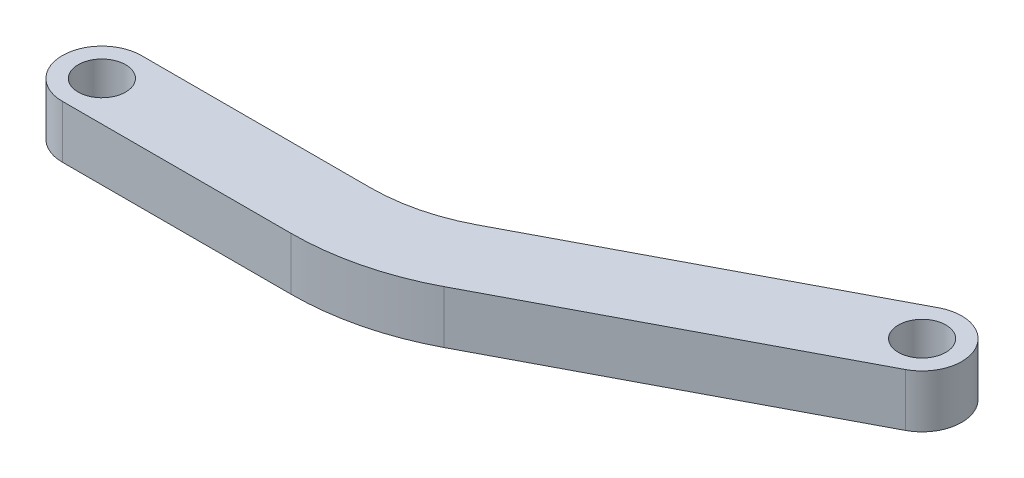
ISO-10303-21;
HEADER;
FILE_DESCRIPTION(('STEP AP214'),'2;1');
FILE_NAME('part.step','',(''),(''),'','','');
FILE_SCHEMA(('AUTOMOTIVE_DESIGN { 1 0 10303 214 1 1 1 1 }'));
ENDSEC;
DATA;
#1=APPLICATION_CONTEXT('core data for automotive mechanical design processes');
#2=APPLICATION_PROTOCOL_DEFINITION('international standard','automotive_design',2000,#1);
#3=PRODUCT_CONTEXT('',#1,'mechanical');
#4=PRODUCT('Part','Part','',(#3));
#5=PRODUCT_RELATED_PRODUCT_CATEGORY('part','',(#4));
#6=PRODUCT_DEFINITION_FORMATION('','',#4);
#7=PRODUCT_DEFINITION_CONTEXT('part definition',#1,'design');
#8=PRODUCT_DEFINITION('design','',#6,#7);
#9=PRODUCT_DEFINITION_SHAPE('','',#8);
#10=(LENGTH_UNIT() NAMED_UNIT(*) SI_UNIT(.MILLI.,.METRE.));
#11=(NAMED_UNIT(*) PLANE_ANGLE_UNIT() SI_UNIT($,.RADIAN.));
#12=(NAMED_UNIT(*) SI_UNIT($,.STERADIAN.) SOLID_ANGLE_UNIT());
#13=UNCERTAINTY_MEASURE_WITH_UNIT(LENGTH_MEASURE(1.E-05),#10,'distance_accuracy_value','');
#14=(GEOMETRIC_REPRESENTATION_CONTEXT(3) GLOBAL_UNCERTAINTY_ASSIGNED_CONTEXT((#13)) GLOBAL_UNIT_ASSIGNED_CONTEXT((#10,
#11,#12)) REPRESENTATION_CONTEXT('',''));
#15=CARTESIAN_POINT('',(0.,0.,0.));
#16=DIRECTION('',(0.,0.,1.));
#17=DIRECTION('',(1.,0.,0.));
#18=AXIS2_PLACEMENT_3D('',#15,#16,#17);
#19=CARTESIAN_POINT('',(0.,6.,0.));
#20=DIRECTION('',(0.,1.,0.));
#21=DIRECTION('',(0.,0.,1.));
#22=AXIS2_PLACEMENT_3D('',#19,#20,#21);
#23=PLANE('',#22);
#24=CARTESIAN_POINT('',(0.,6.,0.));
#25=DIRECTION('',(0.,1.,0.));
#26=DIRECTION('',(0.,0.,1.));
#27=AXIS2_PLACEMENT_3D('',#24,#25,#26);
#28=CIRCLE('',#27,2.7);
#29=CARTESIAN_POINT('',(0.,6.,2.7));
#30=VERTEX_POINT('',#29);
#31=EDGE_CURVE('E150',#30,#30,#28,.T.);
#32=ORIENTED_EDGE('',*,*,#31,.F.);
#33=EDGE_LOOP('',(#32));
#34=FACE_BOUND('',#33,.T.);
#35=CARTESIAN_POINT('',(0.,6.,0.));
#36=DIRECTION('',(0.,1.,0.));
#37=DIRECTION('',(0.,0.,1.));
#38=AXIS2_PLACEMENT_3D('',#35,#36,#37);
#39=CIRCLE('',#38,4.5);
#40=CARTESIAN_POINT('',(0.,6.,-4.5));
#41=VERTEX_POINT('',#40);
#42=CARTESIAN_POINT('',(0.,6.,4.5));
#43=VERTEX_POINT('',#42);
#44=EDGE_CURVE('E168',#41,#43,#39,.T.);
#45=ORIENTED_EDGE('',*,*,#44,.T.);
#46=DIRECTION('',(1.,0.,0.));
#47=VECTOR('',#46,1.);
#48=CARTESIAN_POINT('',(0.,6.,4.5));
#49=LINE('',#48,#47);
#50=CARTESIAN_POINT('',(25.98,6.,4.5));
#51=VERTEX_POINT('',#50);
#52=EDGE_CURVE('E104',#43,#51,#49,.T.);
#53=ORIENTED_EDGE('',*,*,#52,.T.);
#54=CARTESIAN_POINT('',(25.98,6.,-25.5));
#55=DIRECTION('',(0.,1.,0.));
#56=DIRECTION('',(0.,0.,1.));
#57=AXIS2_PLACEMENT_3D('',#54,#55,#56);
#58=CIRCLE('',#57,30.);
#59=CARTESIAN_POINT('',(39.9303771253398,6.,1.05912231344994));
#60=VERTEX_POINT('',#59);
#61=EDGE_CURVE('E189',#51,#60,#58,.T.);
#62=ORIENTED_EDGE('',*,*,#61,.T.);
#63=DIRECTION('',(0.885304077114998,0.,-0.465012570844662));
#64=VECTOR('',#63,1.);
#65=CARTESIAN_POINT('',(39.9303771253398,6.,1.05912231344994));
#66=LINE('',#65,#64);
#67=CARTESIAN_POINT('',(74.342556568801,6.,-17.0161316529825));
#68=VERTEX_POINT('',#67);
#69=EDGE_CURVE('E203',#60,#68,#66,.T.);
#70=ORIENTED_EDGE('',*,*,#69,.T.);
#71=CARTESIAN_POINT('',(72.25,6.,-21.));
#72=DIRECTION('',(0.,1.,0.));
#73=DIRECTION('',(0.,0.,1.));
#74=AXIS2_PLACEMENT_3D('',#71,#72,#73);
#75=CIRCLE('',#74,4.5);
#76=CARTESIAN_POINT('',(70.157443431199,6.,-24.9838683470175));
#77=VERTEX_POINT('',#76);
#78=EDGE_CURVE('E123',#68,#77,#75,.T.);
#79=ORIENTED_EDGE('',*,*,#78,.T.);
#80=DIRECTION('',(-0.885304077114998,0.,0.465012570844662));
#81=VECTOR('',#80,1.);
#82=CARTESIAN_POINT('',(70.157443431199,6.,-24.9838683470175));
#83=LINE('',#82,#81);
#84=CARTESIAN_POINT('',(35.7452639877379,6.,-6.90861438058505));
#85=VERTEX_POINT('',#84);
#86=EDGE_CURVE('E117',#77,#85,#83,.T.);
#87=ORIENTED_EDGE('',*,*,#86,.T.);
#88=CARTESIAN_POINT('',(25.98,6.,-25.5));
#89=DIRECTION('',(0.,-1.,0.));
#90=DIRECTION('',(0.,0.,-1.));
#91=AXIS2_PLACEMENT_3D('',#88,#89,#90);
#92=CIRCLE('',#91,21.);
#93=CARTESIAN_POINT('',(25.98,6.,-4.50000000000001));
#94=VERTEX_POINT('',#93);
#95=EDGE_CURVE('E121',#85,#94,#92,.T.);
#96=ORIENTED_EDGE('',*,*,#95,.T.);
#97=DIRECTION('',(-1.,0.,0.));
#98=VECTOR('',#97,1.);
#99=CARTESIAN_POINT('',(25.98,6.,-4.5));
#100=LINE('',#99,#98);
#101=EDGE_CURVE('E61',#94,#41,#100,.T.);
#102=ORIENTED_EDGE('',*,*,#101,.T.);
#103=EDGE_LOOP('',(#45,#53,#62,#70,#79,#87,#96,#102));
#104=FACE_BOUND('',#103,.T.);
#105=CARTESIAN_POINT('',(72.25,6.,-21.));
#106=DIRECTION('',(0.,1.,0.));
#107=DIRECTION('',(0.,0.,1.));
#108=AXIS2_PLACEMENT_3D('',#105,#106,#107);
#109=CIRCLE('',#108,2.7);
#110=CARTESIAN_POINT('',(72.25,6.,-18.3));
#111=VERTEX_POINT('',#110);
#112=EDGE_CURVE('E217',#111,#111,#109,.T.);
#113=ORIENTED_EDGE('',*,*,#112,.F.);
#114=EDGE_LOOP('',(#113));
#115=FACE_BOUND('',#114,.T.);
#116=ADVANCED_FACE('F43',(#34,#104,#115),#23,.T.);
#117=CARTESIAN_POINT('',(0.,0.,0.));
#118=DIRECTION('',(0.,1.,0.));
#119=DIRECTION('',(0.,0.,1.));
#120=AXIS2_PLACEMENT_3D('',#117,#118,#119);
#121=PLANE('',#120);
#122=CARTESIAN_POINT('',(0.,0.,0.));
#123=DIRECTION('',(0.,1.,0.));
#124=DIRECTION('',(0.,0.,1.));
#125=AXIS2_PLACEMENT_3D('',#122,#123,#124);
#126=CIRCLE('',#125,4.5);
#127=CARTESIAN_POINT('',(0.,0.,-4.5));
#128=VERTEX_POINT('',#127);
#129=CARTESIAN_POINT('',(0.,0.,4.5));
#130=VERTEX_POINT('',#129);
#131=EDGE_CURVE('E145',#128,#130,#126,.T.);
#132=ORIENTED_EDGE('',*,*,#131,.F.);
#133=DIRECTION('',(-1.,0.,0.));
#134=VECTOR('',#133,1.);
#135=CARTESIAN_POINT('',(25.98,0.,-4.5));
#136=LINE('',#135,#134);
#137=CARTESIAN_POINT('',(25.98,0.,-4.50000000000001));
#138=VERTEX_POINT('',#137);
#139=EDGE_CURVE('E96',#138,#128,#136,.T.);
#140=ORIENTED_EDGE('',*,*,#139,.F.);
#141=CARTESIAN_POINT('',(25.98,0.,-25.5));
#142=DIRECTION('',(0.,-1.,0.));
#143=DIRECTION('',(0.,0.,-1.));
#144=AXIS2_PLACEMENT_3D('',#141,#142,#143);
#145=CIRCLE('',#144,21.);
#146=CARTESIAN_POINT('',(35.7452639877379,0.,-6.90861438058505));
#147=VERTEX_POINT('',#146);
#148=EDGE_CURVE('E90',#147,#138,#145,.T.);
#149=ORIENTED_EDGE('',*,*,#148,.F.);
#150=DIRECTION('',(-0.885304077114998,0.,0.465012570844662));
#151=VECTOR('',#150,1.);
#152=CARTESIAN_POINT('',(70.157443431199,0.,-24.9838683470175));
#153=LINE('',#152,#151);
#154=CARTESIAN_POINT('',(70.157443431199,0.,-24.9838683470175));
#155=VERTEX_POINT('',#154);
#156=EDGE_CURVE('E132',#155,#147,#153,.T.);
#157=ORIENTED_EDGE('',*,*,#156,.F.);
#158=CARTESIAN_POINT('',(72.25,0.,-21.));
#159=DIRECTION('',(0.,1.,0.));
#160=DIRECTION('',(0.,0.,1.));
#161=AXIS2_PLACEMENT_3D('',#158,#159,#160);
#162=CIRCLE('',#161,4.5);
#163=CARTESIAN_POINT('',(74.342556568801,0.,-17.0161316529825));
#164=VERTEX_POINT('',#163);
#165=EDGE_CURVE('E159',#164,#155,#162,.T.);
#166=ORIENTED_EDGE('',*,*,#165,.F.);
#167=DIRECTION('',(0.885304077114998,0.,-0.465012570844662));
#168=VECTOR('',#167,1.);
#169=CARTESIAN_POINT('',(39.9303771253398,0.,1.05912231344994));
#170=LINE('',#169,#168);
#171=CARTESIAN_POINT('',(39.9303771253398,0.,1.05912231344994));
#172=VERTEX_POINT('',#171);
#173=EDGE_CURVE('E156',#172,#164,#170,.T.);
#174=ORIENTED_EDGE('',*,*,#173,.F.);
#175=CARTESIAN_POINT('',(25.98,0.,-25.5));
#176=DIRECTION('',(0.,1.,0.));
#177=DIRECTION('',(0.,0.,1.));
#178=AXIS2_PLACEMENT_3D('',#175,#176,#177);
#179=CIRCLE('',#178,30.);
#180=CARTESIAN_POINT('',(25.98,0.,4.5));
#181=VERTEX_POINT('',#180);
#182=EDGE_CURVE('E153',#181,#172,#179,.T.);
#183=ORIENTED_EDGE('',*,*,#182,.F.);
#184=DIRECTION('',(1.,0.,0.));
#185=VECTOR('',#184,1.);
#186=CARTESIAN_POINT('',(0.,0.,4.5));
#187=LINE('',#186,#185);
#188=EDGE_CURVE('E149',#130,#181,#187,.T.);
#189=ORIENTED_EDGE('',*,*,#188,.F.);
#190=EDGE_LOOP('',(#132,#140,#149,#157,#166,#174,#183,#189));
#191=FACE_BOUND('',#190,.T.);
#192=CARTESIAN_POINT('',(0.,0.,0.));
#193=DIRECTION('',(0.,1.,0.));
#194=DIRECTION('',(0.,0.,1.));
#195=AXIS2_PLACEMENT_3D('',#192,#193,#194);
#196=CIRCLE('',#195,2.7);
#197=CARTESIAN_POINT('',(0.,0.,2.7));
#198=VERTEX_POINT('',#197);
#199=EDGE_CURVE('E213',#198,#198,#196,.T.);
#200=ORIENTED_EDGE('',*,*,#199,.T.);
#201=EDGE_LOOP('',(#200));
#202=FACE_BOUND('',#201,.T.);
#203=CARTESIAN_POINT('',(72.25,0.,-21.));
#204=DIRECTION('',(0.,1.,0.));
#205=DIRECTION('',(0.,0.,1.));
#206=AXIS2_PLACEMENT_3D('',#203,#204,#205);
#207=CIRCLE('',#206,2.7);
#208=CARTESIAN_POINT('',(72.25,0.,-18.3));
#209=VERTEX_POINT('',#208);
#210=EDGE_CURVE('E221',#209,#209,#207,.T.);
#211=ORIENTED_EDGE('',*,*,#210,.T.);
#212=EDGE_LOOP('',(#211));
#213=FACE_BOUND('',#212,.T.);
#214=ADVANCED_FACE('F193',(#191,#202,#213),#121,.F.);
#215=CARTESIAN_POINT('',(0.,6.,0.));
#216=DIRECTION('',(0.,-1.,0.));
#217=DIRECTION('',(0.,0.,-1.));
#218=AXIS2_PLACEMENT_3D('',#215,#216,#217);
#219=CYLINDRICAL_SURFACE('',#218,4.5);
#220=ORIENTED_EDGE('',*,*,#131,.T.);
#221=DIRECTION('',(0.,-1.,0.));
#222=VECTOR('',#221,1.);
#223=CARTESIAN_POINT('',(0.,6.,4.5));
#224=LINE('',#223,#222);
#225=EDGE_CURVE('E11',#43,#130,#224,.T.);
#226=ORIENTED_EDGE('',*,*,#225,.F.);
#227=ORIENTED_EDGE('',*,*,#44,.F.);
#228=DIRECTION('',(0.,-1.,0.));
#229=VECTOR('',#228,1.);
#230=CARTESIAN_POINT('',(0.,6.,-4.5));
#231=LINE('',#230,#229);
#232=EDGE_CURVE('E141',#41,#128,#231,.T.);
#233=ORIENTED_EDGE('',*,*,#232,.T.);
#234=EDGE_LOOP('',(#220,#226,#227,#233));
#235=FACE_BOUND('',#234,.T.);
#236=ADVANCED_FACE('F45',(#235),#219,.T.);
#237=CARTESIAN_POINT('',(0.,6.,4.5));
#238=DIRECTION('',(0.,0.,-1.));
#239=DIRECTION('',(-1.,0.,0.));
#240=AXIS2_PLACEMENT_3D('',#237,#238,#239);
#241=PLANE('',#240);
#242=ORIENTED_EDGE('',*,*,#188,.T.);
#243=DIRECTION('',(0.,-1.,0.));
#244=VECTOR('',#243,1.);
#245=CARTESIAN_POINT('',(25.98,6.,4.5));
#246=LINE('',#245,#244);
#247=EDGE_CURVE('E53',#51,#181,#246,.T.);
#248=ORIENTED_EDGE('',*,*,#247,.F.);
#249=ORIENTED_EDGE('',*,*,#52,.F.);
#250=ORIENTED_EDGE('',*,*,#225,.T.);
#251=EDGE_LOOP('',(#242,#248,#249,#250));
#252=FACE_BOUND('',#251,.T.);
#253=ADVANCED_FACE('F255',(#252),#241,.F.);
#254=CARTESIAN_POINT('',(25.98,6.,-25.5));
#255=DIRECTION('',(0.,-1.,0.));
#256=DIRECTION('',(0.,0.,-1.));
#257=AXIS2_PLACEMENT_3D('',#254,#255,#256);
#258=CYLINDRICAL_SURFACE('',#257,30.);
#259=ORIENTED_EDGE('',*,*,#182,.T.);
#260=DIRECTION('',(0.,-1.,0.));
#261=VECTOR('',#260,1.);
#262=CARTESIAN_POINT('',(39.9303771253398,6.,1.05912231344994));
#263=LINE('',#262,#261);
#264=EDGE_CURVE('E179',#60,#172,#263,.T.);
#265=ORIENTED_EDGE('',*,*,#264,.F.);
#266=ORIENTED_EDGE('',*,*,#61,.F.);
#267=ORIENTED_EDGE('',*,*,#247,.T.);
#268=EDGE_LOOP('',(#259,#265,#266,#267));
#269=FACE_BOUND('',#268,.T.);
#270=ADVANCED_FACE('F187',(#269),#258,.T.);
#271=CARTESIAN_POINT('',(39.9303771253398,6.,1.05912231344994));
#272=DIRECTION('',(-0.465012570844662,0.,-0.885304077114998));
#273=DIRECTION('',(-0.885304077114998,0.,0.465012570844662));
#274=AXIS2_PLACEMENT_3D('',#271,#272,#273);
#275=PLANE('',#274);
#276=ORIENTED_EDGE('',*,*,#173,.T.);
#277=DIRECTION('',(0.,-1.,0.));
#278=VECTOR('',#277,1.);
#279=CARTESIAN_POINT('',(74.342556568801,6.,-17.0161316529825));
#280=LINE('',#279,#278);
#281=EDGE_CURVE('E175',#68,#164,#280,.T.);
#282=ORIENTED_EDGE('',*,*,#281,.F.);
#283=ORIENTED_EDGE('',*,*,#69,.F.);
#284=ORIENTED_EDGE('',*,*,#264,.T.);
#285=EDGE_LOOP('',(#276,#282,#283,#284));
#286=FACE_BOUND('',#285,.T.);
#287=ADVANCED_FACE('F198',(#286),#275,.F.);
#288=CARTESIAN_POINT('',(72.25,6.,-21.));
#289=DIRECTION('',(0.,-1.,0.));
#290=DIRECTION('',(0.,0.,-1.));
#291=AXIS2_PLACEMENT_3D('',#288,#289,#290);
#292=CYLINDRICAL_SURFACE('',#291,4.5);
#293=ORIENTED_EDGE('',*,*,#165,.T.);
#294=DIRECTION('',(0.,-1.,0.));
#295=VECTOR('',#294,1.);
#296=CARTESIAN_POINT('',(70.157443431199,6.,-24.9838683470175));
#297=LINE('',#296,#295);
#298=EDGE_CURVE('E134',#77,#155,#297,.T.);
#299=ORIENTED_EDGE('',*,*,#298,.F.);
#300=ORIENTED_EDGE('',*,*,#78,.F.);
#301=ORIENTED_EDGE('',*,*,#281,.T.);
#302=EDGE_LOOP('',(#293,#299,#300,#301));
#303=FACE_BOUND('',#302,.T.);
#304=ADVANCED_FACE('F201',(#303),#292,.T.);
#305=CARTESIAN_POINT('',(70.157443431199,6.,-24.9838683470175));
#306=DIRECTION('',(0.465012570844662,0.,0.885304077114998));
#307=DIRECTION('',(0.885304077114998,0.,-0.465012570844662));
#308=AXIS2_PLACEMENT_3D('',#305,#306,#307);
#309=PLANE('',#308);
#310=ORIENTED_EDGE('',*,*,#156,.T.);
#311=DIRECTION('',(0.,-1.,0.));
#312=VECTOR('',#311,1.);
#313=CARTESIAN_POINT('',(35.7452639877379,6.,-6.90861438058505));
#314=LINE('',#313,#312);
#315=EDGE_CURVE('E129',#85,#147,#314,.T.);
#316=ORIENTED_EDGE('',*,*,#315,.F.);
#317=ORIENTED_EDGE('',*,*,#86,.F.);
#318=ORIENTED_EDGE('',*,*,#298,.T.);
#319=EDGE_LOOP('',(#310,#316,#317,#318));
#320=FACE_BOUND('',#319,.T.);
#321=ADVANCED_FACE('F130',(#320),#309,.F.);
#322=CARTESIAN_POINT('',(25.98,6.,-25.5));
#323=DIRECTION('',(0.,-1.,0.));
#324=DIRECTION('',(0.,0.,-1.));
#325=AXIS2_PLACEMENT_3D('',#322,#323,#324);
#326=CYLINDRICAL_SURFACE('',#325,21.);
#327=ORIENTED_EDGE('',*,*,#148,.T.);
#328=DIRECTION('',(0.,-1.,0.));
#329=VECTOR('',#328,1.);
#330=CARTESIAN_POINT('',(25.98,6.,-4.50000000000001));
#331=LINE('',#330,#329);
#332=EDGE_CURVE('E135',#94,#138,#331,.T.);
#333=ORIENTED_EDGE('',*,*,#332,.F.);
#334=ORIENTED_EDGE('',*,*,#95,.F.);
#335=ORIENTED_EDGE('',*,*,#315,.T.);
#336=EDGE_LOOP('',(#327,#333,#334,#335));
#337=FACE_BOUND('',#336,.T.);
#338=ADVANCED_FACE('F137',(#337),#326,.F.);
#339=CARTESIAN_POINT('',(25.98,6.,-4.5));
#340=DIRECTION('',(0.,0.,1.));
#341=DIRECTION('',(1.,0.,0.));
#342=AXIS2_PLACEMENT_3D('',#339,#340,#341);
#343=PLANE('',#342);
#344=ORIENTED_EDGE('',*,*,#139,.T.);
#345=ORIENTED_EDGE('',*,*,#232,.F.);
#346=ORIENTED_EDGE('',*,*,#101,.F.);
#347=ORIENTED_EDGE('',*,*,#332,.T.);
#348=EDGE_LOOP('',(#344,#345,#346,#347));
#349=FACE_BOUND('',#348,.T.);
#350=ADVANCED_FACE('F243',(#349),#343,.F.);
#351=CARTESIAN_POINT('',(0.,6.,0.));
#352=DIRECTION('',(0.,-1.,0.));
#353=DIRECTION('',(0.,0.,-1.));
#354=AXIS2_PLACEMENT_3D('',#351,#352,#353);
#355=CYLINDRICAL_SURFACE('',#354,2.7);
#356=ORIENTED_EDGE('',*,*,#31,.T.);
#357=EDGE_LOOP('',(#356));
#358=FACE_BOUND('',#357,.T.);
#359=ORIENTED_EDGE('',*,*,#199,.F.);
#360=EDGE_LOOP('',(#359));
#361=FACE_BOUND('',#360,.T.);
#362=ADVANCED_FACE('F240',(#358,#361),#355,.F.);
#363=CARTESIAN_POINT('',(72.25,6.,-21.));
#364=DIRECTION('',(0.,-1.,0.));
#365=DIRECTION('',(0.,0.,-1.));
#366=AXIS2_PLACEMENT_3D('',#363,#364,#365);
#367=CYLINDRICAL_SURFACE('',#366,2.7);
#368=ORIENTED_EDGE('',*,*,#112,.T.);
#369=EDGE_LOOP('',(#368));
#370=FACE_BOUND('',#369,.T.);
#371=ORIENTED_EDGE('',*,*,#210,.F.);
#372=EDGE_LOOP('',(#371));
#373=FACE_BOUND('',#372,.T.);
#374=ADVANCED_FACE('F229',(#370,#373),#367,.F.);
#375=CLOSED_SHELL('',(#116,#214,#236,#253,#270,#287,#304,#321,#338,#350,#362,#374));
#376=MANIFOLD_SOLID_BREP('B2',#375);
#377=ADVANCED_BREP_SHAPE_REPRESENTATION('',(#18,#376),#14);
#378=SHAPE_DEFINITION_REPRESENTATION(#9,#377);
ENDSEC;
END-ISO-10303-21;
